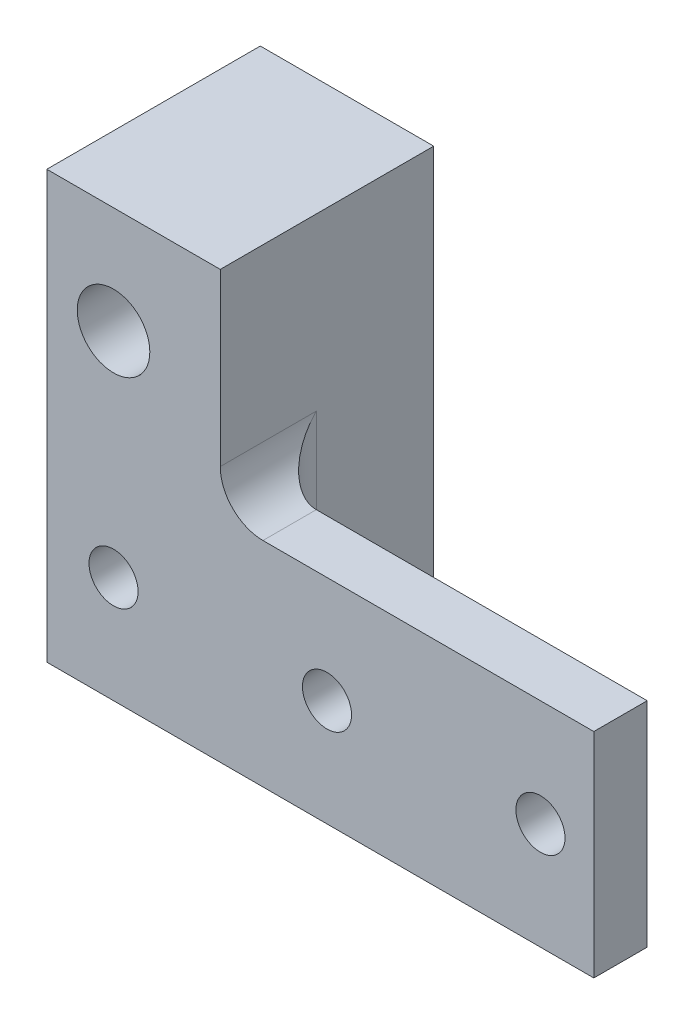
ISO-10303-21;
HEADER;
FILE_DESCRIPTION(('STEP AP214'),'2;1');
FILE_NAME('part.step','',(''),(''),'','','');
FILE_SCHEMA(('AUTOMOTIVE_DESIGN { 1 0 10303 214 1 1 1 1 }'));
ENDSEC;
DATA;
#1=APPLICATION_CONTEXT('core data for automotive mechanical design processes');
#2=APPLICATION_PROTOCOL_DEFINITION('international standard','automotive_design',2000,#1);
#3=PRODUCT_CONTEXT('',#1,'mechanical');
#4=PRODUCT('Part','Part','',(#3));
#5=PRODUCT_RELATED_PRODUCT_CATEGORY('part','',(#4));
#6=PRODUCT_DEFINITION_FORMATION('','',#4);
#7=PRODUCT_DEFINITION_CONTEXT('part definition',#1,'design');
#8=PRODUCT_DEFINITION('design','',#6,#7);
#9=PRODUCT_DEFINITION_SHAPE('','',#8);
#10=(LENGTH_UNIT() NAMED_UNIT(*) SI_UNIT(.MILLI.,.METRE.));
#11=(NAMED_UNIT(*) PLANE_ANGLE_UNIT() SI_UNIT($,.RADIAN.));
#12=(NAMED_UNIT(*) SI_UNIT($,.STERADIAN.) SOLID_ANGLE_UNIT());
#13=UNCERTAINTY_MEASURE_WITH_UNIT(LENGTH_MEASURE(1.E-05),#10,'distance_accuracy_value','');
#14=(GEOMETRIC_REPRESENTATION_CONTEXT(3) GLOBAL_UNCERTAINTY_ASSIGNED_CONTEXT((#13)) GLOBAL_UNIT_ASSIGNED_CONTEXT((#10,
#11,#12)) REPRESENTATION_CONTEXT('',''));
#15=CARTESIAN_POINT('',(0.,0.,0.));
#16=DIRECTION('',(0.,0.,1.));
#17=DIRECTION('',(1.,0.,0.));
#18=AXIS2_PLACEMENT_3D('',#15,#16,#17);
#19=CARTESIAN_POINT('',(12.7,38.1,0.));
#20=DIRECTION('',(0.,0.,1.));
#21=DIRECTION('',(1.,0.,0.));
#22=AXIS2_PLACEMENT_3D('',#19,#20,#21);
#23=CYLINDRICAL_SURFACE('',#22,2.921);
#24=CARTESIAN_POINT('',(12.7,38.1,0.));
#25=DIRECTION('',(0.,0.,1.));
#26=DIRECTION('',(1.,0.,0.));
#27=AXIS2_PLACEMENT_3D('',#24,#25,#26);
#28=CIRCLE('',#27,2.921);
#29=CARTESIAN_POINT('',(15.621,38.1,0.));
#30=VERTEX_POINT('',#29);
#31=EDGE_CURVE('E202',#30,#30,#28,.T.);
#32=ORIENTED_EDGE('',*,*,#31,.F.);
#33=EDGE_LOOP('',(#32));
#34=FACE_BOUND('',#33,.T.);
#35=CARTESIAN_POINT('',(12.7,38.1,12.7));
#36=DIRECTION('',(0.,0.,1.));
#37=DIRECTION('',(1.,0.,0.));
#38=AXIS2_PLACEMENT_3D('',#35,#36,#37);
#39=CIRCLE('',#38,2.921);
#40=CARTESIAN_POINT('',(15.621,38.1,12.7));
#41=VERTEX_POINT('',#40);
#42=EDGE_CURVE('E43',#41,#41,#39,.F.);
#43=ORIENTED_EDGE('',*,*,#42,.F.);
#44=EDGE_LOOP('',(#43));
#45=FACE_BOUND('',#44,.T.);
#46=ADVANCED_FACE('F39',(#34,#45),#23,.F.);
#47=CARTESIAN_POINT('',(69.85,0.,25.4));
#48=DIRECTION('',(0.,1.,0.));
#49=DIRECTION('',(-1.,0.,0.));
#50=AXIS2_PLACEMENT_3D('',#47,#48,#49);
#51=PLANE('',#50);
#52=DIRECTION('',(1.,0.,0.));
#53=VECTOR('',#52,1.);
#54=CARTESIAN_POINT('',(69.85,0.,0.));
#55=LINE('',#54,#53);
#56=CARTESIAN_POINT('',(4.7625,0.,0.));
#57=VERTEX_POINT('',#56);
#58=CARTESIAN_POINT('',(25.4,0.,0.));
#59=VERTEX_POINT('',#58);
#60=EDGE_CURVE('E206',#57,#59,#55,.T.);
#61=ORIENTED_EDGE('',*,*,#60,.T.);
#62=DIRECTION('',(0.,0.,-1.));
#63=VECTOR('',#62,1.);
#64=CARTESIAN_POINT('',(25.4,0.,0.));
#65=LINE('',#64,#63);
#66=CARTESIAN_POINT('',(25.4,0.,13.97));
#67=VERTEX_POINT('',#66);
#68=EDGE_CURVE('E122',#67,#59,#65,.T.);
#69=ORIENTED_EDGE('',*,*,#68,.F.);
#70=CARTESIAN_POINT('',(30.48,0.,13.97));
#71=DIRECTION('',(0.,1.,0.));
#72=DIRECTION('',(-1.,0.,0.));
#73=AXIS2_PLACEMENT_3D('',#70,#71,#72);
#74=CIRCLE('',#73,5.08);
#75=CARTESIAN_POINT('',(30.48,0.,19.05));
#76=VERTEX_POINT('',#75);
#77=EDGE_CURVE('E11',#67,#76,#74,.T.);
#78=ORIENTED_EDGE('',*,*,#77,.T.);
#79=DIRECTION('',(-1.,0.,0.));
#80=VECTOR('',#79,1.);
#81=CARTESIAN_POINT('',(69.85,0.,19.05));
#82=LINE('',#81,#80);
#83=CARTESIAN_POINT('',(69.85,0.,19.05));
#84=VERTEX_POINT('',#83);
#85=EDGE_CURVE('E113',#84,#76,#82,.T.);
#86=ORIENTED_EDGE('',*,*,#85,.F.);
#87=DIRECTION('',(0.,0.,-1.));
#88=VECTOR('',#87,1.);
#89=CARTESIAN_POINT('',(69.85,0.,25.4));
#90=LINE('',#89,#88);
#91=CARTESIAN_POINT('',(69.85,0.,25.4));
#92=VERTEX_POINT('',#91);
#93=EDGE_CURVE('E128',#92,#84,#90,.T.);
#94=ORIENTED_EDGE('',*,*,#93,.F.);
#95=DIRECTION('',(1.,0.,0.));
#96=VECTOR('',#95,1.);
#97=CARTESIAN_POINT('',(69.85,0.,25.4));
#98=LINE('',#97,#96);
#99=CARTESIAN_POINT('',(4.7625,0.,25.4));
#100=VERTEX_POINT('',#99);
#101=EDGE_CURVE('E222',#100,#92,#98,.T.);
#102=ORIENTED_EDGE('',*,*,#101,.F.);
#103=DIRECTION('',(0.,0.,1.));
#104=VECTOR('',#103,1.);
#105=CARTESIAN_POINT('',(4.7625,0.,0.));
#106=LINE('',#105,#104);
#107=EDGE_CURVE('E192',#57,#100,#106,.T.);
#108=ORIENTED_EDGE('',*,*,#107,.F.);
#109=EDGE_LOOP('',(#61,#69,#78,#86,#94,#102,#108));
#110=FACE_BOUND('',#109,.T.);
#111=ADVANCED_FACE('F126',(#110),#51,.F.);
#112=CARTESIAN_POINT('',(69.85,25.4,25.4));
#113=DIRECTION('',(-1.,0.,0.));
#114=DIRECTION('',(0.,0.,1.));
#115=AXIS2_PLACEMENT_3D('',#112,#113,#114);
#116=PLANE('',#115);
#117=ORIENTED_EDGE('',*,*,#93,.T.);
#118=DIRECTION('',(0.,-1.,0.));
#119=VECTOR('',#118,1.);
#120=CARTESIAN_POINT('',(69.85,50.8,19.05));
#121=LINE('',#120,#119);
#122=CARTESIAN_POINT('',(69.85,25.4,19.05));
#123=VERTEX_POINT('',#122);
#124=EDGE_CURVE('E111',#123,#84,#121,.T.);
#125=ORIENTED_EDGE('',*,*,#124,.F.);
#126=DIRECTION('',(0.,0.,-1.));
#127=VECTOR('',#126,1.);
#128=CARTESIAN_POINT('',(69.85,25.4,25.4));
#129=LINE('',#128,#127);
#130=CARTESIAN_POINT('',(69.85,25.4,25.4));
#131=VERTEX_POINT('',#130);
#132=EDGE_CURVE('E137',#131,#123,#129,.T.);
#133=ORIENTED_EDGE('',*,*,#132,.F.);
#134=DIRECTION('',(0.,1.,0.));
#135=VECTOR('',#134,1.);
#136=CARTESIAN_POINT('',(69.85,25.4,25.4));
#137=LINE('',#136,#135);
#138=EDGE_CURVE('E134',#92,#131,#137,.T.);
#139=ORIENTED_EDGE('',*,*,#138,.F.);
#140=EDGE_LOOP('',(#117,#125,#133,#139));
#141=FACE_BOUND('',#140,.T.);
#142=ADVANCED_FACE('F133',(#141),#116,.F.);
#143=CARTESIAN_POINT('',(25.4,25.4,25.4));
#144=DIRECTION('',(0.,-1.,0.));
#145=DIRECTION('',(0.,0.,-1.));
#146=AXIS2_PLACEMENT_3D('',#143,#144,#145);
#147=PLANE('',#146);
#148=DIRECTION('',(-1.,0.,0.));
#149=VECTOR('',#148,1.);
#150=CARTESIAN_POINT('',(25.4,25.4,19.05));
#151=LINE('',#150,#149);
#152=CARTESIAN_POINT('',(30.48,25.4,19.05));
#153=VERTEX_POINT('',#152);
#154=EDGE_CURVE('E115',#123,#153,#151,.T.);
#155=ORIENTED_EDGE('',*,*,#154,.T.);
#156=DIRECTION('',(0.,0.,-1.));
#157=VECTOR('',#156,1.);
#158=CARTESIAN_POINT('',(30.48,25.4,25.4));
#159=LINE('',#158,#157);
#160=CARTESIAN_POINT('',(30.48,25.4,25.4));
#161=VERTEX_POINT('',#160);
#162=EDGE_CURVE('E63',#153,#161,#159,.F.);
#163=ORIENTED_EDGE('',*,*,#162,.T.);
#164=DIRECTION('',(-1.,0.,0.));
#165=VECTOR('',#164,1.);
#166=CARTESIAN_POINT('',(25.4,25.4,25.4));
#167=LINE('',#166,#165);
#168=EDGE_CURVE('E228',#131,#161,#167,.T.);
#169=ORIENTED_EDGE('',*,*,#168,.F.);
#170=ORIENTED_EDGE('',*,*,#132,.T.);
#171=EDGE_LOOP('',(#155,#163,#169,#170));
#172=FACE_BOUND('',#171,.T.);
#173=ADVANCED_FACE('F269',(#172),#147,.F.);
#174=CARTESIAN_POINT('',(25.4,50.8,25.4));
#175=DIRECTION('',(-1.,0.,0.));
#176=DIRECTION('',(0.,-1.,0.));
#177=AXIS2_PLACEMENT_3D('',#174,#175,#176);
#178=PLANE('',#177);
#179=DIRECTION('',(0.,1.,0.));
#180=VECTOR('',#179,1.);
#181=CARTESIAN_POINT('',(25.4,50.8,25.4));
#182=LINE('',#181,#180);
#183=CARTESIAN_POINT('',(25.4,30.48,25.4));
#184=VERTEX_POINT('',#183);
#185=CARTESIAN_POINT('',(25.4,50.8,25.4));
#186=VERTEX_POINT('',#185);
#187=EDGE_CURVE('E231',#184,#186,#182,.T.);
#188=ORIENTED_EDGE('',*,*,#187,.F.);
#189=DIRECTION('',(0.,0.,-1.));
#190=VECTOR('',#189,1.);
#191=CARTESIAN_POINT('',(25.4,30.48,19.05));
#192=LINE('',#191,#190);
#193=CARTESIAN_POINT('',(25.4,30.48,13.97));
#194=VERTEX_POINT('',#193);
#195=EDGE_CURVE('E141',#184,#194,#192,.T.);
#196=ORIENTED_EDGE('',*,*,#195,.T.);
#197=DIRECTION('',(0.,-1.,0.));
#198=VECTOR('',#197,1.);
#199=CARTESIAN_POINT('',(25.4,0.,13.97));
#200=LINE('',#199,#198);
#201=EDGE_CURVE('E136',#194,#67,#200,.T.);
#202=ORIENTED_EDGE('',*,*,#201,.T.);
#203=ORIENTED_EDGE('',*,*,#68,.T.);
#204=DIRECTION('',(0.,1.,0.));
#205=VECTOR('',#204,1.);
#206=CARTESIAN_POINT('',(25.4,50.8,0.));
#207=LINE('',#206,#205);
#208=CARTESIAN_POINT('',(25.4,50.8,0.));
#209=VERTEX_POINT('',#208);
#210=EDGE_CURVE('E240',#59,#209,#207,.T.);
#211=ORIENTED_EDGE('',*,*,#210,.T.);
#212=DIRECTION('',(0.,0.,-1.));
#213=VECTOR('',#212,1.);
#214=CARTESIAN_POINT('',(25.4,50.8,25.4));
#215=LINE('',#214,#213);
#216=EDGE_CURVE('E143',#186,#209,#215,.T.);
#217=ORIENTED_EDGE('',*,*,#216,.F.);
#218=EDGE_LOOP('',(#188,#196,#202,#203,#211,#217));
#219=FACE_BOUND('',#218,.T.);
#220=ADVANCED_FACE('F255',(#219),#178,.F.);
#221=CARTESIAN_POINT('',(0.,50.8,25.4));
#222=DIRECTION('',(0.,-1.,0.));
#223=DIRECTION('',(0.,0.,-1.));
#224=AXIS2_PLACEMENT_3D('',#221,#222,#223);
#225=PLANE('',#224);
#226=DIRECTION('',(-1.,0.,0.));
#227=VECTOR('',#226,1.);
#228=CARTESIAN_POINT('',(0.,50.8,0.));
#229=LINE('',#228,#227);
#230=CARTESIAN_POINT('',(4.7625,50.8,0.));
#231=VERTEX_POINT('',#230);
#232=EDGE_CURVE('E225',#209,#231,#229,.T.);
#233=ORIENTED_EDGE('',*,*,#232,.T.);
#234=DIRECTION('',(0.,0.,1.));
#235=VECTOR('',#234,1.);
#236=CARTESIAN_POINT('',(4.7625,50.8,0.));
#237=LINE('',#236,#235);
#238=CARTESIAN_POINT('',(4.7625,50.8,25.4));
#239=VERTEX_POINT('',#238);
#240=EDGE_CURVE('E195',#231,#239,#237,.T.);
#241=ORIENTED_EDGE('',*,*,#240,.T.);
#242=DIRECTION('',(-1.,0.,0.));
#243=VECTOR('',#242,1.);
#244=CARTESIAN_POINT('',(0.,50.8,25.4));
#245=LINE('',#244,#243);
#246=EDGE_CURVE('E234',#186,#239,#245,.T.);
#247=ORIENTED_EDGE('',*,*,#246,.F.);
#248=ORIENTED_EDGE('',*,*,#216,.T.);
#249=EDGE_LOOP('',(#233,#241,#247,#248));
#250=FACE_BOUND('',#249,.T.);
#251=ADVANCED_FACE('F250',(#250),#225,.F.);
#252=CARTESIAN_POINT('',(0.,0.,25.4));
#253=DIRECTION('',(0.,0.,-1.));
#254=DIRECTION('',(-1.,0.,0.));
#255=AXIS2_PLACEMENT_3D('',#252,#253,#254);
#256=PLANE('',#255);
#257=CARTESIAN_POINT('',(12.7,38.1,25.4));
#258=DIRECTION('',(0.,0.,1.));
#259=DIRECTION('',(1.,0.,0.));
#260=AXIS2_PLACEMENT_3D('',#257,#258,#259);
#261=CIRCLE('',#260,4.318);
#262=CARTESIAN_POINT('',(17.018,38.1,25.4));
#263=VERTEX_POINT('',#262);
#264=EDGE_CURVE('E172',#263,#263,#261,.T.);
#265=ORIENTED_EDGE('',*,*,#264,.F.);
#266=EDGE_LOOP('',(#265));
#267=FACE_BOUND('',#266,.T.);
#268=CARTESIAN_POINT('',(12.7,12.7,25.4));
#269=DIRECTION('',(0.,0.,1.));
#270=DIRECTION('',(1.,0.,0.));
#271=AXIS2_PLACEMENT_3D('',#268,#269,#270);
#272=CIRCLE('',#271,2.921);
#273=CARTESIAN_POINT('',(15.621,12.7,25.4));
#274=VERTEX_POINT('',#273);
#275=EDGE_CURVE('E211',#274,#274,#272,.T.);
#276=ORIENTED_EDGE('',*,*,#275,.F.);
#277=EDGE_LOOP('',(#276));
#278=FACE_BOUND('',#277,.T.);
#279=CARTESIAN_POINT('',(38.1,12.7,25.4));
#280=DIRECTION('',(0.,0.,1.));
#281=DIRECTION('',(1.,0.,0.));
#282=AXIS2_PLACEMENT_3D('',#279,#280,#281);
#283=CIRCLE('',#282,2.921);
#284=CARTESIAN_POINT('',(41.021,12.7,25.4));
#285=VERTEX_POINT('',#284);
#286=EDGE_CURVE('E215',#285,#285,#283,.T.);
#287=ORIENTED_EDGE('',*,*,#286,.F.);
#288=EDGE_LOOP('',(#287));
#289=FACE_BOUND('',#288,.T.);
#290=CARTESIAN_POINT('',(63.5,12.7,25.4));
#291=DIRECTION('',(0.,0.,1.));
#292=DIRECTION('',(1.,0.,0.));
#293=AXIS2_PLACEMENT_3D('',#290,#291,#292);
#294=CIRCLE('',#293,2.92100000000001);
#295=CARTESIAN_POINT('',(66.421,12.7,25.4));
#296=VERTEX_POINT('',#295);
#297=EDGE_CURVE('E199',#296,#296,#294,.T.);
#298=ORIENTED_EDGE('',*,*,#297,.F.);
#299=EDGE_LOOP('',(#298));
#300=FACE_BOUND('',#299,.T.);
#301=ORIENTED_EDGE('',*,*,#246,.T.);
#302=DIRECTION('',(0.,1.,0.));
#303=VECTOR('',#302,1.);
#304=CARTESIAN_POINT('',(4.7625,0.,25.4));
#305=LINE('',#304,#303);
#306=EDGE_CURVE('E187',#100,#239,#305,.T.);
#307=ORIENTED_EDGE('',*,*,#306,.F.);
#308=ORIENTED_EDGE('',*,*,#101,.T.);
#309=ORIENTED_EDGE('',*,*,#138,.T.);
#310=ORIENTED_EDGE('',*,*,#168,.T.);
#311=CARTESIAN_POINT('',(30.48,30.48,25.4));
#312=DIRECTION('',(0.,0.,-1.));
#313=DIRECTION('',(-1.,0.,0.));
#314=AXIS2_PLACEMENT_3D('',#311,#312,#313);
#315=CIRCLE('',#314,5.08);
#316=EDGE_CURVE('E49',#161,#184,#315,.T.);
#317=ORIENTED_EDGE('',*,*,#316,.T.);
#318=ORIENTED_EDGE('',*,*,#187,.T.);
#319=EDGE_LOOP('',(#301,#307,#308,#309,#310,#317,#318));
#320=FACE_BOUND('',#319,.T.);
#321=ADVANCED_FACE('F265',(#267,#278,#289,#300,#320),#256,.F.);
#322=CARTESIAN_POINT('',(0.,0.,0.));
#323=DIRECTION('',(0.,0.,-1.));
#324=DIRECTION('',(-1.,0.,0.));
#325=AXIS2_PLACEMENT_3D('',#322,#323,#324);
#326=PLANE('',#325);
#327=ORIENTED_EDGE('',*,*,#210,.F.);
#328=ORIENTED_EDGE('',*,*,#60,.F.);
#329=DIRECTION('',(0.,1.,0.));
#330=VECTOR('',#329,1.);
#331=CARTESIAN_POINT('',(4.7625,0.,0.));
#332=LINE('',#331,#330);
#333=EDGE_CURVE('E188',#57,#231,#332,.T.);
#334=ORIENTED_EDGE('',*,*,#333,.T.);
#335=ORIENTED_EDGE('',*,*,#232,.F.);
#336=EDGE_LOOP('',(#327,#328,#334,#335));
#337=FACE_BOUND('',#336,.T.);
#338=ORIENTED_EDGE('',*,*,#31,.T.);
#339=EDGE_LOOP('',(#338));
#340=FACE_BOUND('',#339,.T.);
#341=CARTESIAN_POINT('',(12.7,12.7,0.));
#342=DIRECTION('',(0.,0.,1.));
#343=DIRECTION('',(1.,0.,0.));
#344=AXIS2_PLACEMENT_3D('',#341,#342,#343);
#345=CIRCLE('',#344,2.921);
#346=CARTESIAN_POINT('',(15.621,12.7,0.));
#347=VERTEX_POINT('',#346);
#348=EDGE_CURVE('E207',#347,#347,#345,.T.);
#349=ORIENTED_EDGE('',*,*,#348,.T.);
#350=EDGE_LOOP('',(#349));
#351=FACE_BOUND('',#350,.T.);
#352=ADVANCED_FACE('F258',(#337,#340,#351),#326,.T.);
#353=CARTESIAN_POINT('',(63.5,12.7,0.));
#354=DIRECTION('',(0.,0.,1.));
#355=DIRECTION('',(1.,0.,0.));
#356=AXIS2_PLACEMENT_3D('',#353,#354,#355);
#357=CYLINDRICAL_SURFACE('',#356,2.92100000000001);
#358=CARTESIAN_POINT('',(63.5,12.7,19.05));
#359=DIRECTION('',(0.,0.,1.));
#360=DIRECTION('',(1.,0.,0.));
#361=AXIS2_PLACEMENT_3D('',#358,#359,#360);
#362=CIRCLE('',#361,2.92100000000001);
#363=CARTESIAN_POINT('',(66.421,12.7,19.05));
#364=VERTEX_POINT('',#363);
#365=EDGE_CURVE('E149',#364,#364,#362,.F.);
#366=ORIENTED_EDGE('',*,*,#365,.T.);
#367=EDGE_LOOP('',(#366));
#368=FACE_BOUND('',#367,.T.);
#369=ORIENTED_EDGE('',*,*,#297,.T.);
#370=EDGE_LOOP('',(#369));
#371=FACE_BOUND('',#370,.T.);
#372=ADVANCED_FACE('F297',(#368,#371),#357,.F.);
#373=CARTESIAN_POINT('',(38.1,12.7,0.));
#374=DIRECTION('',(0.,0.,1.));
#375=DIRECTION('',(1.,0.,0.));
#376=AXIS2_PLACEMENT_3D('',#373,#374,#375);
#377=CYLINDRICAL_SURFACE('',#376,2.921);
#378=CARTESIAN_POINT('',(38.1,12.7,19.05));
#379=DIRECTION('',(0.,0.,1.));
#380=DIRECTION('',(1.,0.,0.));
#381=AXIS2_PLACEMENT_3D('',#378,#379,#380);
#382=CIRCLE('',#381,2.921);
#383=CARTESIAN_POINT('',(41.021,12.7,19.05));
#384=VERTEX_POINT('',#383);
#385=EDGE_CURVE('E121',#384,#384,#382,.F.);
#386=ORIENTED_EDGE('',*,*,#385,.T.);
#387=EDGE_LOOP('',(#386));
#388=FACE_BOUND('',#387,.T.);
#389=ORIENTED_EDGE('',*,*,#286,.T.);
#390=EDGE_LOOP('',(#389));
#391=FACE_BOUND('',#390,.T.);
#392=ADVANCED_FACE('F293',(#388,#391),#377,.F.);
#393=CARTESIAN_POINT('',(12.7,12.7,0.));
#394=DIRECTION('',(0.,0.,1.));
#395=DIRECTION('',(1.,0.,0.));
#396=AXIS2_PLACEMENT_3D('',#393,#394,#395);
#397=CYLINDRICAL_SURFACE('',#396,2.921);
#398=ORIENTED_EDGE('',*,*,#348,.F.);
#399=EDGE_LOOP('',(#398));
#400=FACE_BOUND('',#399,.T.);
#401=ORIENTED_EDGE('',*,*,#275,.T.);
#402=EDGE_LOOP('',(#401));
#403=FACE_BOUND('',#402,.T.);
#404=ADVANCED_FACE('F290',(#400,#403),#397,.F.);
#405=CARTESIAN_POINT('',(4.7625,0.,0.));
#406=DIRECTION('',(1.,0.,0.));
#407=DIRECTION('',(0.,0.,-1.));
#408=AXIS2_PLACEMENT_3D('',#405,#406,#407);
#409=PLANE('',#408);
#410=ORIENTED_EDGE('',*,*,#306,.T.);
#411=ORIENTED_EDGE('',*,*,#240,.F.);
#412=ORIENTED_EDGE('',*,*,#333,.F.);
#413=ORIENTED_EDGE('',*,*,#107,.T.);
#414=EDGE_LOOP('',(#410,#411,#412,#413));
#415=FACE_BOUND('',#414,.T.);
#416=ADVANCED_FACE('F262',(#415),#409,.F.);
#417=CARTESIAN_POINT('',(69.85,50.8,19.05));
#418=DIRECTION('',(0.,0.,1.));
#419=DIRECTION('',(1.,0.,0.));
#420=AXIS2_PLACEMENT_3D('',#417,#418,#419);
#421=PLANE('',#420);
#422=ORIENTED_EDGE('',*,*,#385,.F.);
#423=EDGE_LOOP('',(#422));
#424=FACE_BOUND('',#423,.T.);
#425=ORIENTED_EDGE('',*,*,#365,.F.);
#426=EDGE_LOOP('',(#425));
#427=FACE_BOUND('',#426,.T.);
#428=ORIENTED_EDGE('',*,*,#85,.T.);
#429=DIRECTION('',(0.,-1.,0.));
#430=VECTOR('',#429,1.);
#431=CARTESIAN_POINT('',(30.48,25.4,19.05));
#432=LINE('',#431,#430);
#433=EDGE_CURVE('E156',#76,#153,#432,.F.);
#434=ORIENTED_EDGE('',*,*,#433,.T.);
#435=ORIENTED_EDGE('',*,*,#154,.F.);
#436=ORIENTED_EDGE('',*,*,#124,.T.);
#437=EDGE_LOOP('',(#428,#434,#435,#436));
#438=FACE_BOUND('',#437,.T.);
#439=ADVANCED_FACE('F112',(#424,#427,#438),#421,.F.);
#440=CARTESIAN_POINT('',(30.48,50.8,13.97));
#441=DIRECTION('',(0.,1.,0.));
#442=DIRECTION('',(-1.,0.,0.));
#443=AXIS2_PLACEMENT_3D('',#440,#441,#442);
#444=CYLINDRICAL_SURFACE('',#443,5.08);
#445=ORIENTED_EDGE('',*,*,#77,.F.);
#446=ORIENTED_EDGE('',*,*,#201,.F.);
#447=CARTESIAN_POINT('',(30.48,30.48,13.97));
#448=DIRECTION('',(0.,0.707106781186547,0.707106781186547));
#449=DIRECTION('',(0.,0.707106781186547,-0.707106781186547));
#450=AXIS2_PLACEMENT_3D('',#447,#448,#449);
#451=ELLIPSE('',#450,7.18420489685532,5.08);
#452=EDGE_CURVE('E130',#153,#194,#451,.F.);
#453=ORIENTED_EDGE('',*,*,#452,.F.);
#454=ORIENTED_EDGE('',*,*,#433,.F.);
#455=EDGE_LOOP('',(#445,#446,#453,#454));
#456=FACE_BOUND('',#455,.T.);
#457=ADVANCED_FACE('F41',(#456),#444,.F.);
#458=CARTESIAN_POINT('',(30.48,30.48,25.4));
#459=DIRECTION('',(0.,0.,1.));
#460=DIRECTION('',(1.,0.,0.));
#461=AXIS2_PLACEMENT_3D('',#458,#459,#460);
#462=CYLINDRICAL_SURFACE('',#461,5.08);
#463=ORIENTED_EDGE('',*,*,#316,.F.);
#464=ORIENTED_EDGE('',*,*,#162,.F.);
#465=ORIENTED_EDGE('',*,*,#452,.T.);
#466=ORIENTED_EDGE('',*,*,#195,.F.);
#467=EDGE_LOOP('',(#463,#464,#465,#466));
#468=FACE_BOUND('',#467,.T.);
#469=ADVANCED_FACE('F267',(#468),#462,.F.);
#470=CARTESIAN_POINT('',(12.7,38.1,12.7));
#471=DIRECTION('',(0.,0.,1.));
#472=DIRECTION('',(1.,0.,0.));
#473=AXIS2_PLACEMENT_3D('',#470,#471,#472);
#474=PLANE('',#473);
#475=CARTESIAN_POINT('',(12.7,38.1,12.7));
#476=DIRECTION('',(0.,0.,1.));
#477=DIRECTION('',(1.,0.,0.));
#478=AXIS2_PLACEMENT_3D('',#475,#476,#477);
#479=CIRCLE('',#478,4.318);
#480=CARTESIAN_POINT('',(17.018,38.1,12.7));
#481=VERTEX_POINT('',#480);
#482=EDGE_CURVE('E167',#481,#481,#479,.T.);
#483=ORIENTED_EDGE('',*,*,#482,.T.);
#484=EDGE_LOOP('',(#483));
#485=FACE_BOUND('',#484,.T.);
#486=ORIENTED_EDGE('',*,*,#42,.T.);
#487=EDGE_LOOP('',(#486));
#488=FACE_BOUND('',#487,.T.);
#489=ADVANCED_FACE('F357',(#485,#488),#474,.T.);
#490=CARTESIAN_POINT('',(12.7,38.1,12.7));
#491=DIRECTION('',(0.,0.,1.));
#492=DIRECTION('',(1.,0.,0.));
#493=AXIS2_PLACEMENT_3D('',#490,#491,#492);
#494=CYLINDRICAL_SURFACE('',#493,4.318);
#495=ORIENTED_EDGE('',*,*,#482,.F.);
#496=EDGE_LOOP('',(#495));
#497=FACE_BOUND('',#496,.T.);
#498=ORIENTED_EDGE('',*,*,#264,.T.);
#499=EDGE_LOOP('',(#498));
#500=FACE_BOUND('',#499,.T.);
#501=ADVANCED_FACE('F362',(#497,#500),#494,.F.);
#502=CLOSED_SHELL('',(#46,#111,#142,#173,#220,#251,#321,#352,#372,#392,#404,#416,#439,#457,#469,
#489,#501));
#503=MANIFOLD_SOLID_BREP('B2',#502);
#504=ADVANCED_BREP_SHAPE_REPRESENTATION('',(#18,#503),#14);
#505=SHAPE_DEFINITION_REPRESENTATION(#9,#504);
ENDSEC;
END-ISO-10303-21;
